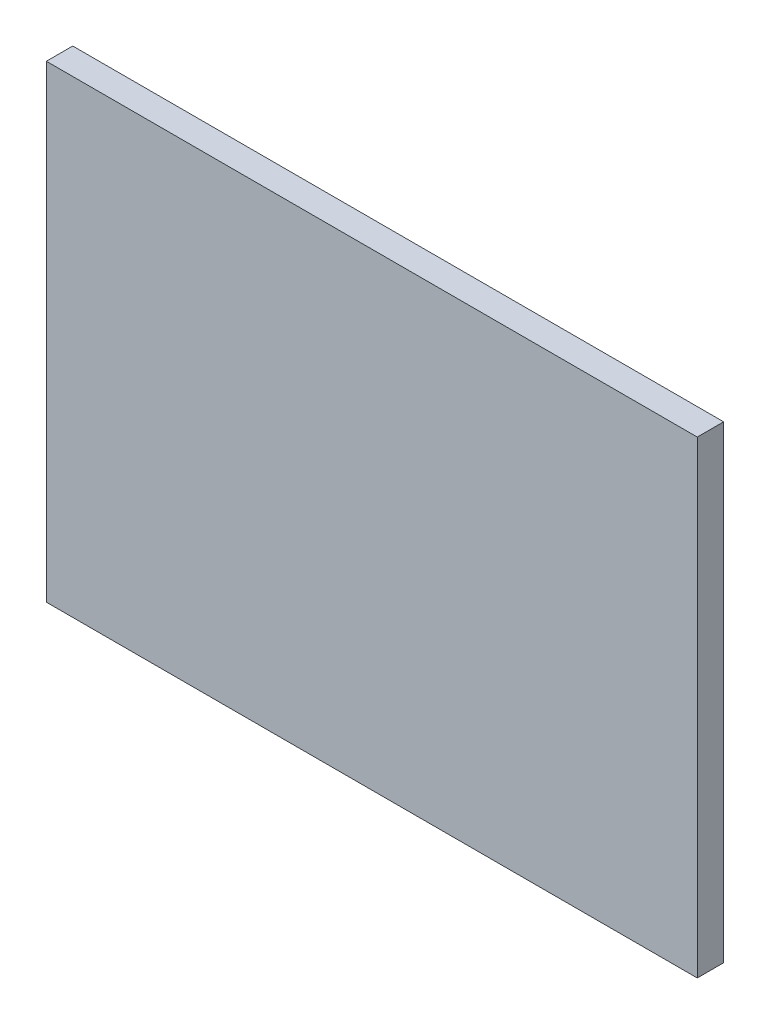
ISO-10303-21;
HEADER;
FILE_DESCRIPTION(('STEP AP214'),'2;1');
FILE_NAME('part.step','',(''),(''),'','','');
FILE_SCHEMA(('AUTOMOTIVE_DESIGN { 1 0 10303 214 1 1 1 1 }'));
ENDSEC;
DATA;
#1=APPLICATION_CONTEXT('core data for automotive mechanical design processes');
#2=APPLICATION_PROTOCOL_DEFINITION('international standard','automotive_design',2000,#1);
#3=PRODUCT_CONTEXT('',#1,'mechanical');
#4=PRODUCT('Part','Part','',(#3));
#5=PRODUCT_RELATED_PRODUCT_CATEGORY('part','',(#4));
#6=PRODUCT_DEFINITION_FORMATION('','',#4);
#7=PRODUCT_DEFINITION_CONTEXT('part definition',#1,'design');
#8=PRODUCT_DEFINITION('design','',#6,#7);
#9=PRODUCT_DEFINITION_SHAPE('','',#8);
#10=(LENGTH_UNIT() NAMED_UNIT(*) SI_UNIT(.MILLI.,.METRE.));
#11=(NAMED_UNIT(*) PLANE_ANGLE_UNIT() SI_UNIT($,.RADIAN.));
#12=(NAMED_UNIT(*) SI_UNIT($,.STERADIAN.) SOLID_ANGLE_UNIT());
#13=UNCERTAINTY_MEASURE_WITH_UNIT(LENGTH_MEASURE(1.E-05),#10,'distance_accuracy_value','');
#14=(GEOMETRIC_REPRESENTATION_CONTEXT(3) GLOBAL_UNCERTAINTY_ASSIGNED_CONTEXT((#13)) GLOBAL_UNIT_ASSIGNED_CONTEXT((#10,
#11,#12)) REPRESENTATION_CONTEXT('',''));
#15=CARTESIAN_POINT('',(0.,0.,0.));
#16=DIRECTION('',(0.,0.,1.));
#17=DIRECTION('',(1.,0.,0.));
#18=AXIS2_PLACEMENT_3D('',#15,#16,#17);
#19=CARTESIAN_POINT('',(185.,133.15,15.));
#20=DIRECTION('',(-1.,0.,0.));
#21=DIRECTION('',(0.,-1.,0.));
#22=AXIS2_PLACEMENT_3D('',#19,#20,#21);
#23=PLANE('',#22);
#24=DIRECTION('',(0.,1.,0.));
#25=VECTOR('',#24,1.);
#26=CARTESIAN_POINT('',(185.,133.15,0.));
#27=LINE('',#26,#25);
#28=CARTESIAN_POINT('',(185.,-133.15,0.));
#29=VERTEX_POINT('',#28);
#30=CARTESIAN_POINT('',(185.,133.15,0.));
#31=VERTEX_POINT('',#30);
#32=EDGE_CURVE('E107',#29,#31,#27,.T.);
#33=ORIENTED_EDGE('',*,*,#32,.T.);
#34=DIRECTION('',(0.,0.,-1.));
#35=VECTOR('',#34,1.);
#36=CARTESIAN_POINT('',(185.,133.15,15.));
#37=LINE('',#36,#35);
#38=CARTESIAN_POINT('',(185.,133.15,15.));
#39=VERTEX_POINT('',#38);
#40=EDGE_CURVE('E11',#39,#31,#37,.T.);
#41=ORIENTED_EDGE('',*,*,#40,.F.);
#42=DIRECTION('',(0.,1.,0.));
#43=VECTOR('',#42,1.);
#44=CARTESIAN_POINT('',(185.,133.15,15.));
#45=LINE('',#44,#43);
#46=CARTESIAN_POINT('',(185.,-133.15,15.));
#47=VERTEX_POINT('',#46);
#48=EDGE_CURVE('E91',#47,#39,#45,.T.);
#49=ORIENTED_EDGE('',*,*,#48,.F.);
#50=DIRECTION('',(0.,0.,-1.));
#51=VECTOR('',#50,1.);
#52=CARTESIAN_POINT('',(185.,-133.15,15.));
#53=LINE('',#52,#51);
#54=EDGE_CURVE('E103',#47,#29,#53,.T.);
#55=ORIENTED_EDGE('',*,*,#54,.T.);
#56=EDGE_LOOP('',(#33,#41,#49,#55));
#57=FACE_BOUND('',#56,.T.);
#58=ADVANCED_FACE('F39',(#57),#23,.F.);
#59=CARTESIAN_POINT('',(-185.,133.15,15.));
#60=DIRECTION('',(0.,-1.,0.));
#61=DIRECTION('',(0.,0.,-1.));
#62=AXIS2_PLACEMENT_3D('',#59,#60,#61);
#63=PLANE('',#62);
#64=DIRECTION('',(-1.,0.,0.));
#65=VECTOR('',#64,1.);
#66=CARTESIAN_POINT('',(-185.,133.15,0.));
#67=LINE('',#66,#65);
#68=CARTESIAN_POINT('',(-185.,133.15,0.));
#69=VERTEX_POINT('',#68);
#70=EDGE_CURVE('E96',#31,#69,#67,.T.);
#71=ORIENTED_EDGE('',*,*,#70,.T.);
#72=DIRECTION('',(0.,0.,-1.));
#73=VECTOR('',#72,1.);
#74=CARTESIAN_POINT('',(-185.,133.15,15.));
#75=LINE('',#74,#73);
#76=CARTESIAN_POINT('',(-185.,133.15,15.));
#77=VERTEX_POINT('',#76);
#78=EDGE_CURVE('E48',#77,#69,#75,.T.);
#79=ORIENTED_EDGE('',*,*,#78,.F.);
#80=DIRECTION('',(-1.,0.,0.));
#81=VECTOR('',#80,1.);
#82=CARTESIAN_POINT('',(-185.,133.15,15.));
#83=LINE('',#82,#81);
#84=EDGE_CURVE('E86',#39,#77,#83,.T.);
#85=ORIENTED_EDGE('',*,*,#84,.F.);
#86=ORIENTED_EDGE('',*,*,#40,.T.);
#87=EDGE_LOOP('',(#71,#79,#85,#86));
#88=FACE_BOUND('',#87,.T.);
#89=ADVANCED_FACE('F95',(#88),#63,.F.);
#90=CARTESIAN_POINT('',(-185.,133.15,15.));
#91=DIRECTION('',(1.,0.,0.));
#92=DIRECTION('',(0.,1.,0.));
#93=AXIS2_PLACEMENT_3D('',#90,#91,#92);
#94=PLANE('',#93);
#95=DIRECTION('',(0.,-1.,0.));
#96=VECTOR('',#95,1.);
#97=CARTESIAN_POINT('',(-185.,133.15,0.));
#98=LINE('',#97,#96);
#99=CARTESIAN_POINT('',(-185.,-133.15,0.));
#100=VERTEX_POINT('',#99);
#101=EDGE_CURVE('E73',#69,#100,#98,.T.);
#102=ORIENTED_EDGE('',*,*,#101,.T.);
#103=DIRECTION('',(0.,0.,-1.));
#104=VECTOR('',#103,1.);
#105=CARTESIAN_POINT('',(-185.,-133.15,15.));
#106=LINE('',#105,#104);
#107=CARTESIAN_POINT('',(-185.,-133.15,15.));
#108=VERTEX_POINT('',#107);
#109=EDGE_CURVE('E98',#108,#100,#106,.T.);
#110=ORIENTED_EDGE('',*,*,#109,.F.);
#111=DIRECTION('',(0.,-1.,0.));
#112=VECTOR('',#111,1.);
#113=CARTESIAN_POINT('',(-185.,133.15,15.));
#114=LINE('',#113,#112);
#115=EDGE_CURVE('E89',#77,#108,#114,.T.);
#116=ORIENTED_EDGE('',*,*,#115,.F.);
#117=ORIENTED_EDGE('',*,*,#78,.T.);
#118=EDGE_LOOP('',(#102,#110,#116,#117));
#119=FACE_BOUND('',#118,.T.);
#120=ADVANCED_FACE('F99',(#119),#94,.F.);
#121=CARTESIAN_POINT('',(-185.,-133.15,15.));
#122=DIRECTION('',(0.,1.,0.));
#123=DIRECTION('',(0.,0.,1.));
#124=AXIS2_PLACEMENT_3D('',#121,#122,#123);
#125=PLANE('',#124);
#126=DIRECTION('',(1.,0.,0.));
#127=VECTOR('',#126,1.);
#128=CARTESIAN_POINT('',(-185.,-133.15,0.));
#129=LINE('',#128,#127);
#130=EDGE_CURVE('E79',#100,#29,#129,.T.);
#131=ORIENTED_EDGE('',*,*,#130,.T.);
#132=ORIENTED_EDGE('',*,*,#54,.F.);
#133=DIRECTION('',(1.,0.,0.));
#134=VECTOR('',#133,1.);
#135=CARTESIAN_POINT('',(-185.,-133.15,15.));
#136=LINE('',#135,#134);
#137=EDGE_CURVE('E56',#108,#47,#136,.T.);
#138=ORIENTED_EDGE('',*,*,#137,.F.);
#139=ORIENTED_EDGE('',*,*,#109,.T.);
#140=EDGE_LOOP('',(#131,#132,#138,#139));
#141=FACE_BOUND('',#140,.T.);
#142=ADVANCED_FACE('F120',(#141),#125,.F.);
#143=CARTESIAN_POINT('',(0.,0.,15.));
#144=DIRECTION('',(0.,0.,1.));
#145=DIRECTION('',(1.,0.,0.));
#146=AXIS2_PLACEMENT_3D('',#143,#144,#145);
#147=PLANE('',#146);
#148=ORIENTED_EDGE('',*,*,#48,.T.);
#149=ORIENTED_EDGE('',*,*,#84,.T.);
#150=ORIENTED_EDGE('',*,*,#115,.T.);
#151=ORIENTED_EDGE('',*,*,#137,.T.);
#152=EDGE_LOOP('',(#148,#149,#150,#151));
#153=FACE_BOUND('',#152,.T.);
#154=ADVANCED_FACE('F87',(#153),#147,.T.);
#155=CARTESIAN_POINT('',(0.,0.,0.));
#156=DIRECTION('',(0.,0.,1.));
#157=DIRECTION('',(1.,0.,0.));
#158=AXIS2_PLACEMENT_3D('',#155,#156,#157);
#159=PLANE('',#158);
#160=ORIENTED_EDGE('',*,*,#32,.F.);
#161=ORIENTED_EDGE('',*,*,#130,.F.);
#162=ORIENTED_EDGE('',*,*,#101,.F.);
#163=ORIENTED_EDGE('',*,*,#70,.F.);
#164=EDGE_LOOP('',(#160,#161,#162,#163));
#165=FACE_BOUND('',#164,.T.);
#166=ADVANCED_FACE('F123',(#165),#159,.F.);
#167=CLOSED_SHELL('',(#58,#89,#120,#142,#154,#166));
#168=MANIFOLD_SOLID_BREP('B2',#167);
#169=ADVANCED_BREP_SHAPE_REPRESENTATION('',(#18,#168),#14);
#170=SHAPE_DEFINITION_REPRESENTATION(#9,#169);
ENDSEC;
END-ISO-10303-21;
